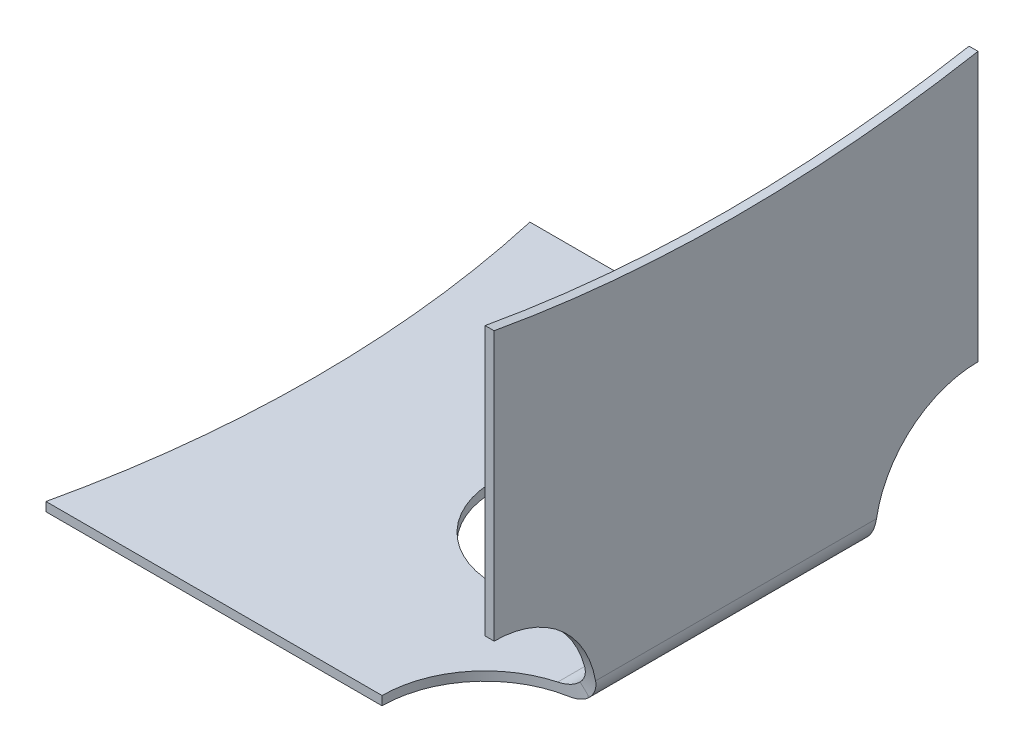
ISO-10303-21;
HEADER;
FILE_DESCRIPTION(('STEP AP214'),'2;1');
FILE_NAME('part.step','',(''),(''),'','','');
FILE_SCHEMA(('AUTOMOTIVE_DESIGN { 1 0 10303 214 1 1 1 1 }'));
ENDSEC;
DATA;
#1=APPLICATION_CONTEXT('core data for automotive mechanical design processes');
#2=APPLICATION_PROTOCOL_DEFINITION('international standard','automotive_design',2000,#1);
#3=PRODUCT_CONTEXT('',#1,'mechanical');
#4=PRODUCT('Part','Part','',(#3));
#5=PRODUCT_RELATED_PRODUCT_CATEGORY('part','',(#4));
#6=PRODUCT_DEFINITION_FORMATION('','',#4);
#7=PRODUCT_DEFINITION_CONTEXT('part definition',#1,'design');
#8=PRODUCT_DEFINITION('design','',#6,#7);
#9=PRODUCT_DEFINITION_SHAPE('','',#8);
#10=(LENGTH_UNIT() NAMED_UNIT(*) SI_UNIT(.MILLI.,.METRE.));
#11=(NAMED_UNIT(*) PLANE_ANGLE_UNIT() SI_UNIT($,.RADIAN.));
#12=(NAMED_UNIT(*) SI_UNIT($,.STERADIAN.) SOLID_ANGLE_UNIT());
#13=UNCERTAINTY_MEASURE_WITH_UNIT(LENGTH_MEASURE(1.E-05),#10,'distance_accuracy_value','');
#14=(GEOMETRIC_REPRESENTATION_CONTEXT(3) GLOBAL_UNCERTAINTY_ASSIGNED_CONTEXT((#13)) GLOBAL_UNIT_ASSIGNED_CONTEXT((#10,
#11,#12)) REPRESENTATION_CONTEXT('',''));
#15=CARTESIAN_POINT('',(0.,0.,0.));
#16=DIRECTION('',(0.,0.,1.));
#17=DIRECTION('',(1.,0.,0.));
#18=AXIS2_PLACEMENT_3D('',#15,#16,#17);
#19=CARTESIAN_POINT('',(-15.3,0.1,0.));
#20=DIRECTION('',(0.,1.,0.));
#21=DIRECTION('',(0.,0.,1.));
#22=AXIS2_PLACEMENT_3D('',#19,#20,#21);
#23=PLANE('',#22);
#24=CARTESIAN_POINT('',(0.,0.1,0.));
#25=DIRECTION('',(0.,1.,0.));
#26=DIRECTION('',(0.,0.,1.));
#27=AXIS2_PLACEMENT_3D('',#24,#25,#26);
#28=CIRCLE('',#27,1.);
#29=CARTESIAN_POINT('',(0.,0.1,1.));
#30=VERTEX_POINT('',#29);
#31=EDGE_CURVE('E226',#30,#30,#28,.T.);
#32=ORIENTED_EDGE('',*,*,#31,.F.);
#33=EDGE_LOOP('',(#32));
#34=FACE_BOUND('',#33,.T.);
#35=CARTESIAN_POINT('',(1.6,0.1,2.7));
#36=DIRECTION('',(0.,-1.,0.));
#37=DIRECTION('',(0.,0.,1.));
#38=AXIS2_PLACEMENT_3D('',#35,#36,#37);
#39=CIRCLE('',#38,1.15);
#40=CARTESIAN_POINT('',(0.45,0.1,2.7));
#41=VERTEX_POINT('',#40);
#42=CARTESIAN_POINT('',(1.3,0.1,1.58981983444127));
#43=VERTEX_POINT('',#42);
#44=EDGE_CURVE('E242',#41,#43,#39,.T.);
#45=ORIENTED_EDGE('',*,*,#44,.T.);
#46=DIRECTION('',(0.,0.,-1.));
#47=VECTOR('',#46,1.);
#48=CARTESIAN_POINT('',(1.3,0.1,0.));
#49=LINE('',#48,#47);
#50=CARTESIAN_POINT('',(1.3,0.1,-1.58981983444127));
#51=VERTEX_POINT('',#50);
#52=EDGE_CURVE('E291',#43,#51,#49,.T.);
#53=ORIENTED_EDGE('',*,*,#52,.T.);
#54=CARTESIAN_POINT('',(1.6,0.1,-2.7));
#55=DIRECTION('',(0.,-1.,0.));
#56=DIRECTION('',(0.,0.,1.));
#57=AXIS2_PLACEMENT_3D('',#54,#55,#56);
#58=CIRCLE('',#57,1.15);
#59=CARTESIAN_POINT('',(0.449999999999999,0.1,-2.7));
#60=VERTEX_POINT('',#59);
#61=EDGE_CURVE('E246',#51,#60,#58,.T.);
#62=ORIENTED_EDGE('',*,*,#61,.T.);
#63=DIRECTION('',(-1.,0.,0.));
#64=VECTOR('',#63,1.);
#65=CARTESIAN_POINT('',(-3.3,0.1,-2.7));
#66=LINE('',#65,#64);
#67=CARTESIAN_POINT('',(-3.3,0.1,-2.7));
#68=VERTEX_POINT('',#67);
#69=EDGE_CURVE('E249',#60,#68,#66,.T.);
#70=ORIENTED_EDGE('',*,*,#69,.T.);
#71=CARTESIAN_POINT('',(-15.3,0.1,0.));
#72=DIRECTION('',(0.,-1.,0.));
#73=DIRECTION('',(0.,0.,1.));
#74=AXIS2_PLACEMENT_3D('',#71,#72,#73);
#75=CIRCLE('',#74,12.3);
#76=CARTESIAN_POINT('',(-3.3,0.1,2.7));
#77=VERTEX_POINT('',#76);
#78=EDGE_CURVE('E234',#68,#77,#75,.T.);
#79=ORIENTED_EDGE('',*,*,#78,.T.);
#80=DIRECTION('',(1.,0.,0.));
#81=VECTOR('',#80,1.);
#82=CARTESIAN_POINT('',(-3.3,0.1,2.7));
#83=LINE('',#82,#81);
#84=EDGE_CURVE('E238',#77,#41,#83,.T.);
#85=ORIENTED_EDGE('',*,*,#84,.T.);
#86=EDGE_LOOP('',(#45,#53,#62,#70,#79,#85));
#87=FACE_BOUND('',#86,.T.);
#88=ADVANCED_FACE('F42',(#34,#87),#23,.T.);
#89=CARTESIAN_POINT('',(-15.3,0.,0.));
#90=DIRECTION('',(0.,1.,0.));
#91=DIRECTION('',(0.,0.,1.));
#92=AXIS2_PLACEMENT_3D('',#89,#90,#91);
#93=PLANE('',#92);
#94=CARTESIAN_POINT('',(1.6,0.,-2.7));
#95=DIRECTION('',(0.,-1.,0.));
#96=DIRECTION('',(0.,0.,1.));
#97=AXIS2_PLACEMENT_3D('',#94,#95,#96);
#98=CIRCLE('',#97,1.15);
#99=CARTESIAN_POINT('',(1.4,0.,-1.56752483470939));
#100=VERTEX_POINT('',#99);
#101=CARTESIAN_POINT('',(0.449999999999999,0.,-2.7));
#102=VERTEX_POINT('',#101);
#103=EDGE_CURVE('E263',#100,#102,#98,.T.);
#104=ORIENTED_EDGE('',*,*,#103,.F.);
#105=DIRECTION('',(0.,0.,-1.));
#106=VECTOR('',#105,1.);
#107=CARTESIAN_POINT('',(1.4,0.,0.));
#108=LINE('',#107,#106);
#109=CARTESIAN_POINT('',(1.4,0.,1.56752483470939));
#110=VERTEX_POINT('',#109);
#111=EDGE_CURVE('E376',#100,#110,#108,.F.);
#112=ORIENTED_EDGE('',*,*,#111,.T.);
#113=CARTESIAN_POINT('',(1.6,0.,2.7));
#114=DIRECTION('',(0.,-1.,0.));
#115=DIRECTION('',(0.,0.,1.));
#116=AXIS2_PLACEMENT_3D('',#113,#114,#115);
#117=CIRCLE('',#116,1.15);
#118=CARTESIAN_POINT('',(0.45,0.,2.7));
#119=VERTEX_POINT('',#118);
#120=EDGE_CURVE('E259',#119,#110,#117,.T.);
#121=ORIENTED_EDGE('',*,*,#120,.F.);
#122=DIRECTION('',(1.,0.,0.));
#123=VECTOR('',#122,1.);
#124=CARTESIAN_POINT('',(-3.3,0.,2.7));
#125=LINE('',#124,#123);
#126=CARTESIAN_POINT('',(-3.3,0.,2.7));
#127=VERTEX_POINT('',#126);
#128=EDGE_CURVE('E256',#127,#119,#125,.T.);
#129=ORIENTED_EDGE('',*,*,#128,.F.);
#130=CARTESIAN_POINT('',(-15.3,0.,0.));
#131=DIRECTION('',(0.,-1.,0.));
#132=DIRECTION('',(0.,0.,1.));
#133=AXIS2_PLACEMENT_3D('',#130,#131,#132);
#134=CIRCLE('',#133,12.3);
#135=CARTESIAN_POINT('',(-3.3,0.,-2.7));
#136=VERTEX_POINT('',#135);
#137=EDGE_CURVE('E230',#136,#127,#134,.T.);
#138=ORIENTED_EDGE('',*,*,#137,.F.);
#139=DIRECTION('',(-1.,0.,0.));
#140=VECTOR('',#139,1.);
#141=CARTESIAN_POINT('',(-3.3,0.,-2.7));
#142=LINE('',#141,#140);
#143=EDGE_CURVE('E239',#102,#136,#142,.T.);
#144=ORIENTED_EDGE('',*,*,#143,.F.);
#145=EDGE_LOOP('',(#104,#112,#121,#129,#138,#144));
#146=FACE_BOUND('',#145,.T.);
#147=CARTESIAN_POINT('',(0.,0.,0.));
#148=DIRECTION('',(0.,1.,0.));
#149=DIRECTION('',(0.,0.,1.));
#150=AXIS2_PLACEMENT_3D('',#147,#148,#149);
#151=CIRCLE('',#150,1.);
#152=CARTESIAN_POINT('',(0.,0.,1.));
#153=VERTEX_POINT('',#152);
#154=EDGE_CURVE('E225',#153,#153,#151,.T.);
#155=ORIENTED_EDGE('',*,*,#154,.T.);
#156=EDGE_LOOP('',(#155));
#157=FACE_BOUND('',#156,.T.);
#158=ADVANCED_FACE('F427',(#146,#157),#93,.F.);
#159=CARTESIAN_POINT('',(-15.3,0.1,0.));
#160=DIRECTION('',(0.,-1.,0.));
#161=DIRECTION('',(0.,0.,-1.));
#162=AXIS2_PLACEMENT_3D('',#159,#160,#161);
#163=CYLINDRICAL_SURFACE('',#162,12.3);
#164=ORIENTED_EDGE('',*,*,#137,.T.);
#165=DIRECTION('',(0.,-1.,0.));
#166=VECTOR('',#165,1.);
#167=CARTESIAN_POINT('',(-3.3,0.1,2.7));
#168=LINE('',#167,#166);
#169=EDGE_CURVE('E287',#77,#127,#168,.T.);
#170=ORIENTED_EDGE('',*,*,#169,.F.);
#171=ORIENTED_EDGE('',*,*,#78,.F.);
#172=DIRECTION('',(0.,-1.,0.));
#173=VECTOR('',#172,1.);
#174=CARTESIAN_POINT('',(-3.3,0.1,-2.7));
#175=LINE('',#174,#173);
#176=EDGE_CURVE('E252',#68,#136,#175,.T.);
#177=ORIENTED_EDGE('',*,*,#176,.T.);
#178=EDGE_LOOP('',(#164,#170,#171,#177));
#179=FACE_BOUND('',#178,.T.);
#180=ADVANCED_FACE('F345',(#179),#163,.F.);
#181=CARTESIAN_POINT('',(-3.3,0.1,2.7));
#182=DIRECTION('',(0.,0.,-1.));
#183=DIRECTION('',(-1.,0.,0.));
#184=AXIS2_PLACEMENT_3D('',#181,#182,#183);
#185=PLANE('',#184);
#186=ORIENTED_EDGE('',*,*,#128,.T.);
#187=DIRECTION('',(0.,-1.,0.));
#188=VECTOR('',#187,1.);
#189=CARTESIAN_POINT('',(0.45,0.1,2.7));
#190=LINE('',#189,#188);
#191=EDGE_CURVE('E283',#41,#119,#190,.T.);
#192=ORIENTED_EDGE('',*,*,#191,.F.);
#193=ORIENTED_EDGE('',*,*,#84,.F.);
#194=ORIENTED_EDGE('',*,*,#169,.T.);
#195=EDGE_LOOP('',(#186,#192,#193,#194));
#196=FACE_BOUND('',#195,.T.);
#197=ADVANCED_FACE('F361',(#196),#185,.F.);
#198=CARTESIAN_POINT('',(1.6,0.1,2.7));
#199=DIRECTION('',(0.,-1.,0.));
#200=DIRECTION('',(0.,0.,-1.));
#201=AXIS2_PLACEMENT_3D('',#198,#199,#200);
#202=CYLINDRICAL_SURFACE('',#201,1.15);
#203=ORIENTED_EDGE('',*,*,#120,.T.);
#204=CARTESIAN_POINT('',(1.4,0.,1.56752483470939));
#205=CARTESIAN_POINT('',(1.41625761108417,-1.77308610557631E-05,1.56463995433271));
#206=CARTESIAN_POINT('',(1.4325829807663,0.00132068311080368,1.56213117442583));
#207=CARTESIAN_POINT('',(1.46490765745055,0.00665265260208878,1.55784951106619));
#208=CARTESIAN_POINT('',(1.48090667599133,0.0106484603730065,1.55607725391915));
#209=CARTESIAN_POINT('',(1.51210458775291,0.0212435795487358,1.55325566662701));
#210=CARTESIAN_POINT('',(1.52730260421451,0.0278456793048069,1.55220711405286));
#211=CARTESIAN_POINT('',(1.55639570397459,0.0434622790516982,1.55073521901179));
#212=CARTESIAN_POINT('',(1.57029384680225,0.0524709114422833,1.55031037197899));
#213=CARTESIAN_POINT('',(1.58906767459055,0.066963097770404,1.55003740393774));
#214=CARTESIAN_POINT('',(1.59462329931995,0.0715813866546129,1.5499993327242));
#215=CARTESIAN_POINT('',(1.6,0.0763932022500211,1.55));
#216=B_SPLINE_CURVE_WITH_KNOTS('',3,(#204,#205,#206,#207,#208,#209,#210,#211,#212,#213,#214,
#215),.UNSPECIFIED.,.F.,.F.,(4,2,2,2,2,4),(0.,0.0494780484766777,0.0989980851852979,
0.148571245297286,0.198024622367586,0.219677436332476),.UNSPECIFIED.);
#217=CARTESIAN_POINT('',(1.6,0.0763932022500211,1.55));
#218=VERTEX_POINT('',#217);
#219=EDGE_CURVE('E367',#110,#218,#216,.T.);
#220=ORIENTED_EDGE('',*,*,#219,.T.);
#221=DIRECTION('',(0.,-1.,0.));
#222=VECTOR('',#221,1.);
#223=CARTESIAN_POINT('',(1.6,0.1,1.55));
#224=LINE('',#223,#222);
#225=CARTESIAN_POINT('',(1.6,0.1,1.55));
#226=VERTEX_POINT('',#225);
#227=EDGE_CURVE('E279',#226,#218,#224,.T.);
#228=ORIENTED_EDGE('',*,*,#227,.F.);
#229=CARTESIAN_POINT('',(1.6,0.1,2.7));
#230=DIRECTION('',(-0.707106781186547,-0.707106781186547,0.));
#231=DIRECTION('',(-0.707106781186547,0.707106781186547,0.));
#232=AXIS2_PLACEMENT_3D('',#229,#230,#231);
#233=ELLIPSE('',#232,1.62634559672906,1.15);
#234=CARTESIAN_POINT('',(1.51213203435596,0.187867965644035,1.55336177430997));
#235=VERTEX_POINT('',#234);
#236=EDGE_CURVE('E11',#226,#235,#233,.F.);
#237=ORIENTED_EDGE('',*,*,#236,.T.);
#238=CARTESIAN_POINT('',(1.51213203435596,0.187867965644035,1.55336177430997));
#239=CARTESIAN_POINT('',(1.50042890222459,0.176139343531759,1.55425203507878));
#240=CARTESIAN_POINT('',(1.48774257233443,0.165417772899793,1.55541022862498));
#241=CARTESIAN_POINT('',(1.46084495388604,0.146231184400934,1.55837198338496));
#242=CARTESIAN_POINT('',(1.44663474044753,0.137764590119523,1.56017509167315));
#243=CARTESIAN_POINT('',(1.41710052679303,0.123307111670712,1.56453898536456));
#244=CARTESIAN_POINT('',(1.4017755826822,0.117318354985142,1.56710041864549));
#245=CARTESIAN_POINT('',(1.37051121950384,0.107949307334389,1.57301873818061));
#246=CARTESIAN_POINT('',(1.35457264945966,0.104565539255558,1.5763745562425));
#247=CARTESIAN_POINT('',(1.33214385045395,0.101656164758695,1.58160956902368));
#248=CARTESIAN_POINT('',(1.32570469786197,0.101033455964476,1.58317133793257));
#249=CARTESIAN_POINT('',(1.31283952887129,0.10020587139162,1.58640999842637));
#250=CARTESIAN_POINT('',(1.30641350805705,0.100000322184276,1.58808669994174));
#251=CARTESIAN_POINT('',(1.3,0.0999999999999999,1.58981983444127));
#252=B_SPLINE_CURVE_WITH_KNOTS('',3,(#238,#239,#240,#241,#242,#243,#244,#245,#246,#247,#248,
#249,#250,#251),.UNSPECIFIED.,.F.,.F.,(4,2,2,2,2,2,4),(0.,0.0497147067412529,0.0993945670301325,
0.149116994579882,0.198772937484424,0.218726943526725,0.238648711730055),.UNSPECIFIED.);
#253=EDGE_CURVE('E350',#235,#43,#252,.T.);
#254=ORIENTED_EDGE('',*,*,#253,.T.);
#255=ORIENTED_EDGE('',*,*,#44,.F.);
#256=ORIENTED_EDGE('',*,*,#191,.T.);
#257=EDGE_LOOP('',(#203,#220,#228,#237,#254,#255,#256));
#258=FACE_BOUND('',#257,.T.);
#259=ADVANCED_FACE('F357',(#258),#202,.F.);
#260=CARTESIAN_POINT('',(1.6,0.1,-2.7));
#261=DIRECTION('',(0.,-1.,0.));
#262=DIRECTION('',(0.,0.,-1.));
#263=AXIS2_PLACEMENT_3D('',#260,#261,#262);
#264=CYLINDRICAL_SURFACE('',#263,1.15);
#265=DIRECTION('',(0.,-1.,0.));
#266=VECTOR('',#265,1.);
#267=CARTESIAN_POINT('',(1.6,0.1,-1.55));
#268=LINE('',#267,#266);
#269=CARTESIAN_POINT('',(1.6,0.1,-1.55));
#270=VERTEX_POINT('',#269);
#271=CARTESIAN_POINT('',(1.6,0.0763932022500209,-1.55));
#272=VERTEX_POINT('',#271);
#273=EDGE_CURVE('E275',#270,#272,#268,.T.);
#274=ORIENTED_EDGE('',*,*,#273,.T.);
#275=CARTESIAN_POINT('',(1.6,0.0763932022500209,-1.55));
#276=CARTESIAN_POINT('',(1.58770433874363,0.0653733545739846,-1.54999251518939));
#277=CARTESIAN_POINT('',(1.57447849704289,0.0553933357446631,-1.55019642996839));
#278=CARTESIAN_POINT('',(1.54657467695279,0.0377291102898726,-1.55115888457357));
#279=CARTESIAN_POINT('',(1.53189539583141,0.0300469885448609,-1.55191792592805));
#280=CARTESIAN_POINT('',(1.50150064680179,0.0172086859378326,-1.55412411362883));
#281=CARTESIAN_POINT('',(1.48578410095803,0.012055181267842,-1.55557198583018));
#282=CARTESIAN_POINT('',(1.45383464388751,0.00441537550572195,-1.55921432344967));
#283=CARTESIAN_POINT('',(1.43760307582313,0.00192264320206486,-1.56140697170492));
#284=CARTESIAN_POINT('',(1.41422944892576,0.000251602225951346,-1.56508020588344));
#285=CARTESIAN_POINT('',(1.40710636187039,-2.133388706828E-06,-1.56626831495262));
#286=CARTESIAN_POINT('',(1.4,0.,-1.56752483470939));
#287=B_SPLINE_CURVE_WITH_KNOTS('',3,(#275,#276,#277,#278,#279,#280,#281,#282,#283,#284,#285,
#286),.UNSPECIFIED.,.F.,.F.,(4,2,2,2,2,4),(0.,0.0494754497329487,0.0989956532915576,
0.148568154701315,0.198020563832721,0.219677302359075),.UNSPECIFIED.);
#288=EDGE_CURVE('E415',#272,#100,#287,.T.);
#289=ORIENTED_EDGE('',*,*,#288,.T.);
#290=ORIENTED_EDGE('',*,*,#103,.T.);
#291=DIRECTION('',(0.,-1.,0.));
#292=VECTOR('',#291,1.);
#293=CARTESIAN_POINT('',(0.449999999999999,0.1,-2.7));
#294=LINE('',#293,#292);
#295=EDGE_CURVE('E271',#60,#102,#294,.T.);
#296=ORIENTED_EDGE('',*,*,#295,.F.);
#297=ORIENTED_EDGE('',*,*,#61,.F.);
#298=CARTESIAN_POINT('',(1.3,0.1,-1.58981983444127));
#299=CARTESIAN_POINT('',(1.31622390716886,0.0999819010421164,-1.5854210659723));
#300=CARTESIAN_POINT('',(1.33255924921591,0.101315490722608,-1.5814027608881));
#301=CARTESIAN_POINT('',(1.3649783380524,0.106665577378778,-1.57415265054211));
#302=CARTESIAN_POINT('',(1.38106183762942,0.110684559751717,-1.57092157766709));
#303=CARTESIAN_POINT('',(1.41249850293682,0.121394320493779,-1.56527480604364));
#304=CARTESIAN_POINT('',(1.4278503346869,0.128089784628989,-1.5628605510726));
#305=CARTESIAN_POINT('',(1.45727585850625,0.1439868704928,-1.55879476569268));
#306=CARTESIAN_POINT('',(1.47135223319222,0.153183061361899,-1.55714160312218));
#307=CARTESIAN_POINT('',(1.48940295984166,0.167267489283693,-1.55532003211494));
#308=CARTESIAN_POINT('',(1.49412539324706,0.171191912020815,-1.55487467119368));
#309=CARTESIAN_POINT('',(1.5033189254917,0.179321699060969,-1.55406199551378));
#310=CARTESIAN_POINT('',(1.50779031763307,0.183526722396167,-1.55369458822183));
#311=CARTESIAN_POINT('',(1.51213203435597,0.187867965644025,-1.55336177430996));
#312=B_SPLINE_CURVE_WITH_KNOTS('',3,(#298,#299,#300,#301,#302,#303,#304,#305,#306,#307,#308,
#309,#310,#311),.UNSPECIFIED.,.F.,.F.,(4,2,2,2,2,2,4),(0.,0.0503840239488885,0.100814744267517,
0.1513341439872,0.201744694409134,0.220204604920849,0.238642478826416),.UNSPECIFIED.);
#313=CARTESIAN_POINT('',(1.51213203435596,0.187867965644035,-1.55336177430997));
#314=VERTEX_POINT('',#313);
#315=EDGE_CURVE('E66',#51,#314,#312,.T.);
#316=ORIENTED_EDGE('',*,*,#315,.T.);
#317=CARTESIAN_POINT('',(1.6,0.1,-2.7));
#318=DIRECTION('',(-0.707106781186547,-0.707106781186547,0.));
#319=DIRECTION('',(0.707106781186547,-0.707106781186547,0.));
#320=AXIS2_PLACEMENT_3D('',#317,#318,#319);
#321=ELLIPSE('',#320,1.62634559672906,1.15);
#322=EDGE_CURVE('E52',#270,#314,#321,.T.);
#323=ORIENTED_EDGE('',*,*,#322,.F.);
#324=EDGE_LOOP('',(#274,#289,#290,#296,#297,#316,#323));
#325=FACE_BOUND('',#324,.T.);
#326=ADVANCED_FACE('F360',(#325),#264,.F.);
#327=CARTESIAN_POINT('',(-3.3,0.1,-2.7));
#328=DIRECTION('',(0.,0.,1.));
#329=DIRECTION('',(1.,0.,0.));
#330=AXIS2_PLACEMENT_3D('',#327,#328,#329);
#331=PLANE('',#330);
#332=ORIENTED_EDGE('',*,*,#143,.T.);
#333=ORIENTED_EDGE('',*,*,#176,.F.);
#334=ORIENTED_EDGE('',*,*,#69,.F.);
#335=ORIENTED_EDGE('',*,*,#295,.T.);
#336=EDGE_LOOP('',(#332,#333,#334,#335));
#337=FACE_BOUND('',#336,.T.);
#338=ADVANCED_FACE('F440',(#337),#331,.F.);
#339=CARTESIAN_POINT('',(0.,0.1,0.));
#340=DIRECTION('',(0.,-1.,0.));
#341=DIRECTION('',(0.,0.,-1.));
#342=AXIS2_PLACEMENT_3D('',#339,#340,#341);
#343=CYLINDRICAL_SURFACE('',#342,1.);
#344=ORIENTED_EDGE('',*,*,#31,.T.);
#345=EDGE_LOOP('',(#344));
#346=FACE_BOUND('',#345,.T.);
#347=ORIENTED_EDGE('',*,*,#154,.F.);
#348=EDGE_LOOP('',(#347));
#349=FACE_BOUND('',#348,.T.);
#350=ADVANCED_FACE('F459',(#346,#349),#343,.F.);
#351=CARTESIAN_POINT('',(1.7,0.,1.55));
#352=DIRECTION('',(0.,0.,-1.));
#353=DIRECTION('',(-1.,0.,0.));
#354=AXIS2_PLACEMENT_3D('',#351,#352,#353);
#355=PLANE('',#354);
#356=ORIENTED_EDGE('',*,*,#227,.T.);
#357=CARTESIAN_POINT('',(1.4,0.3,1.55));
#358=DIRECTION('',(0.,0.,-1.));
#359=DIRECTION('',(-1.,0.,0.));
#360=AXIS2_PLACEMENT_3D('',#357,#358,#359);
#361=CIRCLE('',#360,0.3);
#362=CARTESIAN_POINT('',(1.62360679774998,0.1,1.55));
#363=VERTEX_POINT('',#362);
#364=EDGE_CURVE('E375',#218,#363,#361,.F.);
#365=ORIENTED_EDGE('',*,*,#364,.T.);
#366=DIRECTION('',(-1.,0.,0.));
#367=VECTOR('',#366,1.);
#368=CARTESIAN_POINT('',(1.7,0.1,1.55));
#369=LINE('',#368,#367);
#370=EDGE_CURVE('E178',#363,#226,#369,.T.);
#371=ORIENTED_EDGE('',*,*,#370,.T.);
#372=EDGE_LOOP('',(#356,#365,#371));
#373=FACE_BOUND('',#372,.T.);
#374=ADVANCED_FACE('F434',(#373),#355,.F.);
#375=CARTESIAN_POINT('',(1.7,0.,-1.55));
#376=DIRECTION('',(0.,0.,1.));
#377=DIRECTION('',(0.,-1.,0.));
#378=AXIS2_PLACEMENT_3D('',#375,#376,#377);
#379=PLANE('',#378);
#380=DIRECTION('',(-1.,0.,0.));
#381=VECTOR('',#380,1.);
#382=CARTESIAN_POINT('',(1.7,0.1,-1.55));
#383=LINE('',#382,#381);
#384=CARTESIAN_POINT('',(1.62360679774998,0.1,-1.55));
#385=VERTEX_POINT('',#384);
#386=EDGE_CURVE('E221',#385,#270,#383,.T.);
#387=ORIENTED_EDGE('',*,*,#386,.F.);
#388=CARTESIAN_POINT('',(1.4,0.3,-1.55));
#389=DIRECTION('',(0.,0.,1.));
#390=DIRECTION('',(0.,-1.,0.));
#391=AXIS2_PLACEMENT_3D('',#388,#389,#390);
#392=CIRCLE('',#391,0.3);
#393=EDGE_CURVE('E308',#385,#272,#392,.F.);
#394=ORIENTED_EDGE('',*,*,#393,.T.);
#395=ORIENTED_EDGE('',*,*,#273,.F.);
#396=EDGE_LOOP('',(#387,#394,#395));
#397=FACE_BOUND('',#396,.T.);
#398=ADVANCED_FACE('F414',(#397),#379,.F.);
#399=CARTESIAN_POINT('',(1.7,0.,0.));
#400=DIRECTION('',(-1.,0.,0.));
#401=DIRECTION('',(0.,0.,1.));
#402=AXIS2_PLACEMENT_3D('',#399,#400,#401);
#403=PLANE('',#402);
#404=CARTESIAN_POINT('',(1.7,0.1,2.7));
#405=DIRECTION('',(-1.,0.,0.));
#406=DIRECTION('',(0.,0.,-1.));
#407=AXIS2_PLACEMENT_3D('',#404,#405,#406);
#408=CIRCLE('',#407,1.15);
#409=CARTESIAN_POINT('',(1.7,1.25,2.7));
#410=VERTEX_POINT('',#409);
#411=CARTESIAN_POINT('',(1.7,0.3,1.56752483470939));
#412=VERTEX_POINT('',#411);
#413=EDGE_CURVE('E168',#410,#412,#408,.T.);
#414=ORIENTED_EDGE('',*,*,#413,.T.);
#415=DIRECTION('',(0.,0.,-1.));
#416=VECTOR('',#415,1.);
#417=CARTESIAN_POINT('',(1.7,0.3,0.));
#418=LINE('',#417,#416);
#419=CARTESIAN_POINT('',(1.7,0.3,-1.56752483470939));
#420=VERTEX_POINT('',#419);
#421=EDGE_CURVE('E165',#412,#420,#418,.T.);
#422=ORIENTED_EDGE('',*,*,#421,.T.);
#423=CARTESIAN_POINT('',(1.7,0.1,-2.7));
#424=DIRECTION('',(-1.,0.,0.));
#425=DIRECTION('',(0.,0.,-1.));
#426=AXIS2_PLACEMENT_3D('',#423,#424,#425);
#427=CIRCLE('',#426,1.15);
#428=CARTESIAN_POINT('',(1.7,1.25,-2.7));
#429=VERTEX_POINT('',#428);
#430=EDGE_CURVE('E157',#420,#429,#427,.T.);
#431=ORIENTED_EDGE('',*,*,#430,.T.);
#432=DIRECTION('',(0.,1.,0.));
#433=VECTOR('',#432,1.);
#434=CARTESIAN_POINT('',(1.7,1.25,-2.7));
#435=LINE('',#434,#433);
#436=CARTESIAN_POINT('',(1.7,4.25,-2.7));
#437=VERTEX_POINT('',#436);
#438=EDGE_CURVE('E162',#429,#437,#435,.T.);
#439=ORIENTED_EDGE('',*,*,#438,.T.);
#440=CARTESIAN_POINT('',(1.7,19.1574645731593,0.));
#441=DIRECTION('',(-1.,0.,0.));
#442=DIRECTION('',(0.,0.,-1.));
#443=AXIS2_PLACEMENT_3D('',#440,#441,#442);
#444=CIRCLE('',#443,15.15);
#445=CARTESIAN_POINT('',(1.7,4.25,2.7));
#446=VERTEX_POINT('',#445);
#447=EDGE_CURVE('E185',#437,#446,#444,.T.);
#448=ORIENTED_EDGE('',*,*,#447,.T.);
#449=DIRECTION('',(0.,-1.,0.));
#450=VECTOR('',#449,1.);
#451=CARTESIAN_POINT('',(1.7,1.25,2.7));
#452=LINE('',#451,#450);
#453=EDGE_CURVE('E188',#446,#410,#452,.T.);
#454=ORIENTED_EDGE('',*,*,#453,.T.);
#455=EDGE_LOOP('',(#414,#422,#431,#439,#448,#454));
#456=FACE_BOUND('',#455,.T.);
#457=ADVANCED_FACE('F160',(#456),#403,.F.);
#458=CARTESIAN_POINT('',(1.7,0.1,2.7));
#459=DIRECTION('',(-1.,0.,0.));
#460=DIRECTION('',(0.,0.,1.));
#461=AXIS2_PLACEMENT_3D('',#458,#459,#460);
#462=CYLINDRICAL_SURFACE('',#461,1.15);
#463=ORIENTED_EDGE('',*,*,#370,.F.);
#464=CARTESIAN_POINT('',(1.62360679774998,0.1,1.55));
#465=CARTESIAN_POINT('',(1.63462664542602,0.112295661256373,1.54999251518939));
#466=CARTESIAN_POINT('',(1.64460666425534,0.125521502957113,1.55019642996839));
#467=CARTESIAN_POINT('',(1.66227088971013,0.153425323047205,1.55115888457357));
#468=CARTESIAN_POINT('',(1.66995301145514,0.168104604168586,1.55191792592805));
#469=CARTESIAN_POINT('',(1.68279131406217,0.198499353198208,1.55412411362883));
#470=CARTESIAN_POINT('',(1.68794481873216,0.214215899041972,1.55557198583018));
#471=CARTESIAN_POINT('',(1.69558462449428,0.246165356112492,1.55921432344967));
#472=CARTESIAN_POINT('',(1.69807735679794,0.262396924176872,1.56140697170492));
#473=CARTESIAN_POINT('',(1.69974839777405,0.285770551074236,1.56508020588344));
#474=CARTESIAN_POINT('',(1.70000213338871,0.292893638129614,1.56626831495262));
#475=CARTESIAN_POINT('',(1.7,0.3,1.56752483470939));
#476=B_SPLINE_CURVE_WITH_KNOTS('',3,(#464,#465,#466,#467,#468,#469,#470,#471,#472,#473,#474,
#475),.UNSPECIFIED.,.F.,.F.,(4,2,2,2,2,4),(0.,0.0494754497329487,0.0989956532915576,
0.148568154701315,0.198020563832721,0.219677302359076),.UNSPECIFIED.);
#477=EDGE_CURVE('E378',#363,#412,#476,.T.);
#478=ORIENTED_EDGE('',*,*,#477,.T.);
#479=ORIENTED_EDGE('',*,*,#413,.F.);
#480=DIRECTION('',(-1.,0.,0.));
#481=VECTOR('',#480,1.);
#482=CARTESIAN_POINT('',(1.7,1.25,2.7));
#483=LINE('',#482,#481);
#484=CARTESIAN_POINT('',(1.6,1.25,2.7));
#485=VERTEX_POINT('',#484);
#486=EDGE_CURVE('E194',#410,#485,#483,.T.);
#487=ORIENTED_EDGE('',*,*,#486,.T.);
#488=CARTESIAN_POINT('',(1.6,0.1,2.7));
#489=DIRECTION('',(-1.,0.,0.));
#490=DIRECTION('',(0.,0.,-1.));
#491=AXIS2_PLACEMENT_3D('',#488,#489,#490);
#492=CIRCLE('',#491,1.15);
#493=CARTESIAN_POINT('',(1.6,0.4,1.58981983444127));
#494=VERTEX_POINT('',#493);
#495=EDGE_CURVE('E195',#485,#494,#492,.T.);
#496=ORIENTED_EDGE('',*,*,#495,.T.);
#497=CARTESIAN_POINT('',(1.6,0.4,1.58981983444127));
#498=CARTESIAN_POINT('',(1.60001809895788,0.383776092831139,1.5854210659723));
#499=CARTESIAN_POINT('',(1.59868450927739,0.367440750784087,1.5814027608881));
#500=CARTESIAN_POINT('',(1.59333442262122,0.335021661947599,1.57415265054211));
#501=CARTESIAN_POINT('',(1.58931544024828,0.318938162370579,1.57092157766709));
#502=CARTESIAN_POINT('',(1.57860567950622,0.287501497063178,1.56527480604364));
#503=CARTESIAN_POINT('',(1.57191021537101,0.272149665313097,1.5628605510726));
#504=CARTESIAN_POINT('',(1.5560131295072,0.242724141493749,1.55879476569268));
#505=CARTESIAN_POINT('',(1.5468169386381,0.228647766807776,1.55714160312218));
#506=CARTESIAN_POINT('',(1.53273251071631,0.210597040158343,1.55532003211494));
#507=CARTESIAN_POINT('',(1.52880808797919,0.205874606752942,1.55487467119368));
#508=CARTESIAN_POINT('',(1.52067830093903,0.196681074508299,1.55406199551378));
#509=CARTESIAN_POINT('',(1.51647327760383,0.192209682366927,1.55369458822183));
#510=CARTESIAN_POINT('',(1.51213203435598,0.187867965644028,1.55336177430996));
#511=B_SPLINE_CURVE_WITH_KNOTS('',3,(#497,#498,#499,#500,#501,#502,#503,#504,#505,#506,#507,
#508,#509,#510),.UNSPECIFIED.,.F.,.F.,(4,2,2,2,2,2,4),(0.,0.0503840239488883,0.100814744267517,
0.1513341439872,0.201744694409133,0.220204604920849,0.238642478826416),.UNSPECIFIED.);
#512=EDGE_CURVE('E59',#494,#235,#511,.T.);
#513=ORIENTED_EDGE('',*,*,#512,.T.);
#514=ORIENTED_EDGE('',*,*,#236,.F.);
#515=EDGE_LOOP('',(#463,#478,#479,#487,#496,#513,#514));
#516=FACE_BOUND('',#515,.T.);
#517=ADVANCED_FACE('F314',(#516),#462,.F.);
#518=CARTESIAN_POINT('',(1.7,0.1,-2.7));
#519=DIRECTION('',(-1.,0.,0.));
#520=DIRECTION('',(0.,0.,1.));
#521=AXIS2_PLACEMENT_3D('',#518,#519,#520);
#522=CYLINDRICAL_SURFACE('',#521,1.15);
#523=ORIENTED_EDGE('',*,*,#430,.F.);
#524=CARTESIAN_POINT('',(1.7,0.3,-1.56752483470939));
#525=CARTESIAN_POINT('',(1.70001773086106,0.283742388915825,-1.56463995433271));
#526=CARTESIAN_POINT('',(1.6986793168892,0.267417019233702,-1.56213117442583));
#527=CARTESIAN_POINT('',(1.69334734739791,0.235092342549453,-1.55784951106619));
#528=CARTESIAN_POINT('',(1.68935153962699,0.219093324008669,-1.55607725391915));
#529=CARTESIAN_POINT('',(1.67875642045126,0.187895412247088,-1.55325566662701));
#530=CARTESIAN_POINT('',(1.67215432069519,0.172697395785492,-1.55220711405286));
#531=CARTESIAN_POINT('',(1.6565377209483,0.143604296025415,-1.55073521901179));
#532=CARTESIAN_POINT('',(1.64752908855772,0.129706153197749,-1.55031037197899));
#533=CARTESIAN_POINT('',(1.6330369022296,0.11093232540945,-1.55003740393774));
#534=CARTESIAN_POINT('',(1.62841861334539,0.105376700680055,-1.5499993327242));
#535=CARTESIAN_POINT('',(1.62360679774998,0.1,-1.55));
#536=B_SPLINE_CURVE_WITH_KNOTS('',3,(#524,#525,#526,#527,#528,#529,#530,#531,#532,#533,#534,
#535),.UNSPECIFIED.,.F.,.F.,(4,2,2,2,2,4),(0.,0.0494780484766775,0.0989980851852976,
0.148571245297285,0.198024622367586,0.219677436332477),.UNSPECIFIED.);
#537=EDGE_CURVE('E300',#420,#385,#536,.T.);
#538=ORIENTED_EDGE('',*,*,#537,.T.);
#539=ORIENTED_EDGE('',*,*,#386,.T.);
#540=ORIENTED_EDGE('',*,*,#322,.T.);
#541=CARTESIAN_POINT('',(1.51213203435596,0.187867965644035,-1.55336177430997));
#542=CARTESIAN_POINT('',(1.52386065646824,0.199571097775413,-1.55425203507878));
#543=CARTESIAN_POINT('',(1.53458222710021,0.212257427665574,-1.55541022862498));
#544=CARTESIAN_POINT('',(1.55376881559907,0.239155046113962,-1.55837198338496));
#545=CARTESIAN_POINT('',(1.56223540988048,0.25336525955247,-1.56017509167315));
#546=CARTESIAN_POINT('',(1.57669288832929,0.282899473206971,-1.56453898536456));
#547=CARTESIAN_POINT('',(1.58268164501486,0.298224417317803,-1.56710041864549));
#548=CARTESIAN_POINT('',(1.59205069266561,0.329488780496157,-1.57301873818061));
#549=CARTESIAN_POINT('',(1.59543446074444,0.345427350540344,-1.5763745562425));
#550=CARTESIAN_POINT('',(1.59834383524131,0.367856149546046,-1.58160956902368));
#551=CARTESIAN_POINT('',(1.59896654403552,0.374295302138028,-1.58317133793257));
#552=CARTESIAN_POINT('',(1.59979412860838,0.387160471128713,-1.58640999842637));
#553=CARTESIAN_POINT('',(1.59999967781572,0.393586491942952,-1.58808669994174));
#554=CARTESIAN_POINT('',(1.6,0.4,-1.58981983444127));
#555=B_SPLINE_CURVE_WITH_KNOTS('',3,(#541,#542,#543,#544,#545,#546,#547,#548,#549,#550,#551,
#552,#553,#554),.UNSPECIFIED.,.F.,.F.,(4,2,2,2,2,2,4),(0.,0.049714706741253,0.0993945670301326,
0.149116994579882,0.198772937484424,0.218726943526725,0.238648711730056),.UNSPECIFIED.);
#556=CARTESIAN_POINT('',(1.6,0.4,-1.58981983444127));
#557=VERTEX_POINT('',#556);
#558=EDGE_CURVE('E320',#314,#557,#555,.T.);
#559=ORIENTED_EDGE('',*,*,#558,.T.);
#560=CARTESIAN_POINT('',(1.6,0.1,-2.7));
#561=DIRECTION('',(-1.,0.,0.));
#562=DIRECTION('',(0.,0.,-1.));
#563=AXIS2_PLACEMENT_3D('',#560,#561,#562);
#564=CIRCLE('',#563,1.15);
#565=CARTESIAN_POINT('',(1.6,1.25,-2.7));
#566=VERTEX_POINT('',#565);
#567=EDGE_CURVE('E174',#557,#566,#564,.T.);
#568=ORIENTED_EDGE('',*,*,#567,.T.);
#569=DIRECTION('',(-1.,0.,0.));
#570=VECTOR('',#569,1.);
#571=CARTESIAN_POINT('',(1.7,1.25,-2.7));
#572=LINE('',#571,#570);
#573=EDGE_CURVE('E171',#429,#566,#572,.T.);
#574=ORIENTED_EDGE('',*,*,#573,.F.);
#575=EDGE_LOOP('',(#523,#538,#539,#540,#559,#568,#574));
#576=FACE_BOUND('',#575,.T.);
#577=ADVANCED_FACE('F172',(#576),#522,.F.);
#578=CARTESIAN_POINT('',(1.7,1.25,-2.7));
#579=DIRECTION('',(0.,0.,1.));
#580=DIRECTION('',(1.,0.,0.));
#581=AXIS2_PLACEMENT_3D('',#578,#579,#580);
#582=PLANE('',#581);
#583=DIRECTION('',(0.,1.,0.));
#584=VECTOR('',#583,1.);
#585=CARTESIAN_POINT('',(1.6,1.25,-2.7));
#586=LINE('',#585,#584);
#587=CARTESIAN_POINT('',(1.6,4.25,-2.7));
#588=VERTEX_POINT('',#587);
#589=EDGE_CURVE('E200',#566,#588,#586,.T.);
#590=ORIENTED_EDGE('',*,*,#589,.T.);
#591=DIRECTION('',(-1.,0.,0.));
#592=VECTOR('',#591,1.);
#593=CARTESIAN_POINT('',(1.7,4.25,-2.7));
#594=LINE('',#593,#592);
#595=EDGE_CURVE('E179',#437,#588,#594,.T.);
#596=ORIENTED_EDGE('',*,*,#595,.F.);
#597=ORIENTED_EDGE('',*,*,#438,.F.);
#598=ORIENTED_EDGE('',*,*,#573,.T.);
#599=EDGE_LOOP('',(#590,#596,#597,#598));
#600=FACE_BOUND('',#599,.T.);
#601=ADVANCED_FACE('F181',(#600),#582,.F.);
#602=CARTESIAN_POINT('',(1.7,19.1574645731593,0.));
#603=DIRECTION('',(-1.,0.,0.));
#604=DIRECTION('',(0.,0.,1.));
#605=AXIS2_PLACEMENT_3D('',#602,#603,#604);
#606=CYLINDRICAL_SURFACE('',#605,15.15);
#607=CARTESIAN_POINT('',(1.6,19.1574645731593,0.));
#608=DIRECTION('',(-1.,0.,0.));
#609=DIRECTION('',(0.,0.,-1.));
#610=AXIS2_PLACEMENT_3D('',#607,#608,#609);
#611=CIRCLE('',#610,15.15);
#612=CARTESIAN_POINT('',(1.6,4.25,2.7));
#613=VERTEX_POINT('',#612);
#614=EDGE_CURVE('E203',#588,#613,#611,.T.);
#615=ORIENTED_EDGE('',*,*,#614,.T.);
#616=DIRECTION('',(-1.,0.,0.));
#617=VECTOR('',#616,1.);
#618=CARTESIAN_POINT('',(1.7,4.25,2.7));
#619=LINE('',#618,#617);
#620=EDGE_CURVE('E212',#446,#613,#619,.T.);
#621=ORIENTED_EDGE('',*,*,#620,.F.);
#622=ORIENTED_EDGE('',*,*,#447,.F.);
#623=ORIENTED_EDGE('',*,*,#595,.T.);
#624=EDGE_LOOP('',(#615,#621,#622,#623));
#625=FACE_BOUND('',#624,.T.);
#626=ADVANCED_FACE('F406',(#625),#606,.F.);
#627=CARTESIAN_POINT('',(1.7,1.25,2.7));
#628=DIRECTION('',(0.,0.,-1.));
#629=DIRECTION('',(-1.,0.,0.));
#630=AXIS2_PLACEMENT_3D('',#627,#628,#629);
#631=PLANE('',#630);
#632=DIRECTION('',(0.,-1.,0.));
#633=VECTOR('',#632,1.);
#634=CARTESIAN_POINT('',(1.6,1.25,2.7));
#635=LINE('',#634,#633);
#636=EDGE_CURVE('E206',#613,#485,#635,.T.);
#637=ORIENTED_EDGE('',*,*,#636,.T.);
#638=ORIENTED_EDGE('',*,*,#486,.F.);
#639=ORIENTED_EDGE('',*,*,#453,.F.);
#640=ORIENTED_EDGE('',*,*,#620,.T.);
#641=EDGE_LOOP('',(#637,#638,#639,#640));
#642=FACE_BOUND('',#641,.T.);
#643=ADVANCED_FACE('F402',(#642),#631,.F.);
#644=CARTESIAN_POINT('',(1.6,0.1,2.7));
#645=DIRECTION('',(1.,0.,0.));
#646=DIRECTION('',(0.,0.,-1.));
#647=AXIS2_PLACEMENT_3D('',#644,#645,#646);
#648=PLANE('',#647);
#649=ORIENTED_EDGE('',*,*,#567,.F.);
#650=DIRECTION('',(0.,0.,-1.));
#651=VECTOR('',#650,1.);
#652=CARTESIAN_POINT('',(1.6,0.4,2.7));
#653=LINE('',#652,#651);
#654=EDGE_CURVE('E295',#557,#494,#653,.F.);
#655=ORIENTED_EDGE('',*,*,#654,.T.);
#656=ORIENTED_EDGE('',*,*,#495,.F.);
#657=ORIENTED_EDGE('',*,*,#636,.F.);
#658=ORIENTED_EDGE('',*,*,#614,.F.);
#659=ORIENTED_EDGE('',*,*,#589,.F.);
#660=EDGE_LOOP('',(#649,#655,#656,#657,#658,#659));
#661=FACE_BOUND('',#660,.T.);
#662=ADVANCED_FACE('F343',(#661),#648,.F.);
#663=CARTESIAN_POINT('',(1.3,0.4,0.));
#664=DIRECTION('',(0.,0.,-1.));
#665=DIRECTION('',(-1.,0.,0.));
#666=AXIS2_PLACEMENT_3D('',#663,#664,#665);
#667=CYLINDRICAL_SURFACE('',#666,0.3);
#668=ORIENTED_EDGE('',*,*,#512,.F.);
#669=ORIENTED_EDGE('',*,*,#654,.F.);
#670=ORIENTED_EDGE('',*,*,#558,.F.);
#671=ORIENTED_EDGE('',*,*,#315,.F.);
#672=ORIENTED_EDGE('',*,*,#52,.F.);
#673=ORIENTED_EDGE('',*,*,#253,.F.);
#674=EDGE_LOOP('',(#668,#669,#670,#671,#672,#673));
#675=FACE_BOUND('',#674,.T.);
#676=ADVANCED_FACE('F339',(#675),#667,.F.);
#677=CARTESIAN_POINT('',(1.4,0.3,0.));
#678=DIRECTION('',(0.,0.,-1.));
#679=DIRECTION('',(-1.,0.,0.));
#680=AXIS2_PLACEMENT_3D('',#677,#678,#679);
#681=CYLINDRICAL_SURFACE('',#680,0.3);
#682=ORIENTED_EDGE('',*,*,#219,.F.);
#683=ORIENTED_EDGE('',*,*,#111,.F.);
#684=ORIENTED_EDGE('',*,*,#288,.F.);
#685=ORIENTED_EDGE('',*,*,#393,.F.);
#686=ORIENTED_EDGE('',*,*,#537,.F.);
#687=ORIENTED_EDGE('',*,*,#421,.F.);
#688=ORIENTED_EDGE('',*,*,#477,.F.);
#689=ORIENTED_EDGE('',*,*,#364,.F.);
#690=EDGE_LOOP('',(#682,#683,#684,#685,#686,#687,#688,#689));
#691=FACE_BOUND('',#690,.T.);
#692=ADVANCED_FACE('F44',(#691),#681,.T.);
#693=CLOSED_SHELL('',(#88,#158,#180,#197,#259,#326,#338,#350,#374,#398,#457,#517,#577,#601,#626,
#643,#662,#676,#692));
#694=MANIFOLD_SOLID_BREP('B2',#693);
#695=ADVANCED_BREP_SHAPE_REPRESENTATION('',(#18,#694),#14);
#696=SHAPE_DEFINITION_REPRESENTATION(#9,#695);
ENDSEC;
END-ISO-10303-21;
